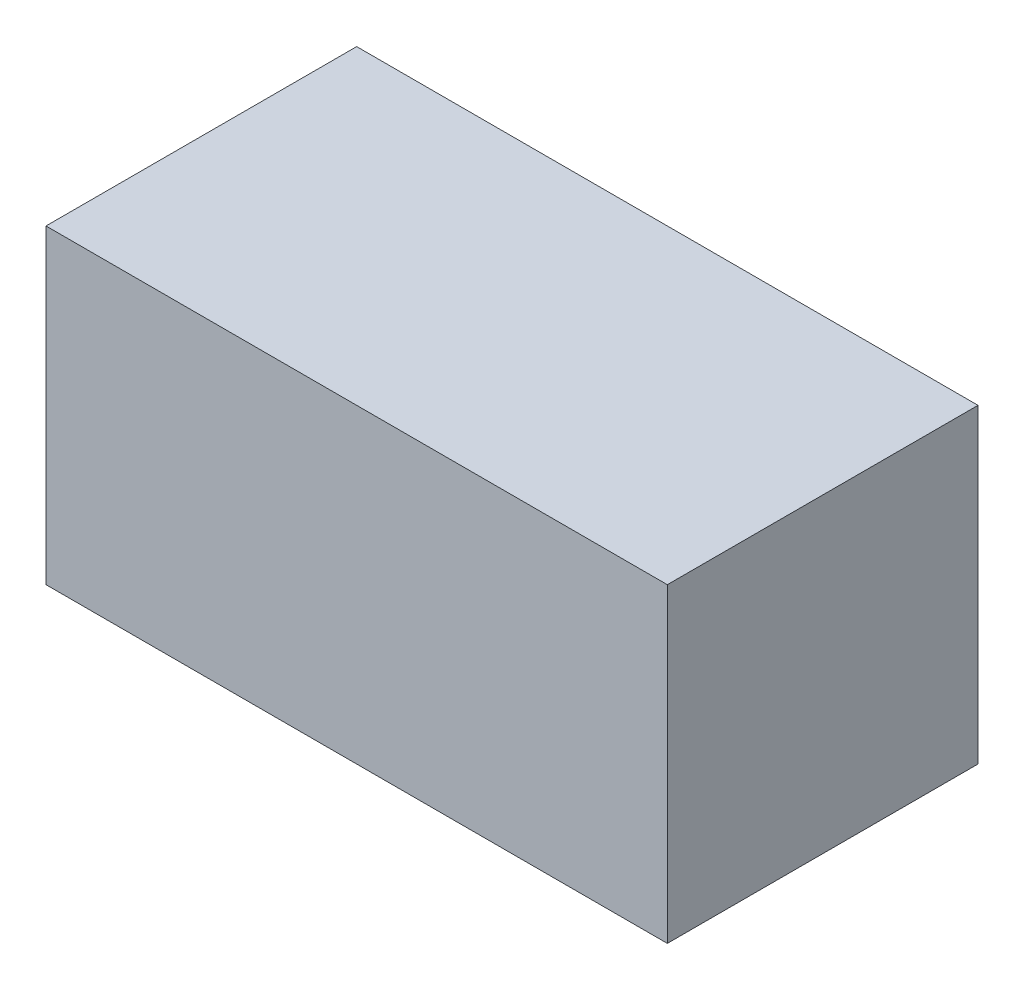
ISO-10303-21;
HEADER;
FILE_DESCRIPTION(('STEP AP214'),'2;1');
FILE_NAME('part.step','',(''),(''),'','','');
FILE_SCHEMA(('AUTOMOTIVE_DESIGN { 1 0 10303 214 1 1 1 1 }'));
ENDSEC;
DATA;
#1=APPLICATION_CONTEXT('core data for automotive mechanical design processes');
#2=APPLICATION_PROTOCOL_DEFINITION('international standard','automotive_design',2000,#1);
#3=PRODUCT_CONTEXT('',#1,'mechanical');
#4=PRODUCT('Part','Part','',(#3));
#5=PRODUCT_RELATED_PRODUCT_CATEGORY('part','',(#4));
#6=PRODUCT_DEFINITION_FORMATION('','',#4);
#7=PRODUCT_DEFINITION_CONTEXT('part definition',#1,'design');
#8=PRODUCT_DEFINITION('design','',#6,#7);
#9=PRODUCT_DEFINITION_SHAPE('','',#8);
#10=(LENGTH_UNIT() NAMED_UNIT(*) SI_UNIT(.MILLI.,.METRE.));
#11=(NAMED_UNIT(*) PLANE_ANGLE_UNIT() SI_UNIT($,.RADIAN.));
#12=(NAMED_UNIT(*) SI_UNIT($,.STERADIAN.) SOLID_ANGLE_UNIT());
#13=UNCERTAINTY_MEASURE_WITH_UNIT(LENGTH_MEASURE(1.E-05),#10,'distance_accuracy_value','');
#14=(GEOMETRIC_REPRESENTATION_CONTEXT(3) GLOBAL_UNCERTAINTY_ASSIGNED_CONTEXT((#13)) GLOBAL_UNIT_ASSIGNED_CONTEXT((#10,
#11,#12)) REPRESENTATION_CONTEXT('',''));
#15=CARTESIAN_POINT('',(0.,0.,0.));
#16=DIRECTION('',(0.,0.,1.));
#17=DIRECTION('',(1.,0.,0.));
#18=AXIS2_PLACEMENT_3D('',#15,#16,#17);
#19=CARTESIAN_POINT('',(0.,20.,10.));
#20=DIRECTION('',(1.,0.,0.));
#21=DIRECTION('',(0.,0.,-1.));
#22=AXIS2_PLACEMENT_3D('',#19,#20,#21);
#23=PLANE('',#22);
#24=DIRECTION('',(0.,-1.,0.));
#25=VECTOR('',#24,1.);
#26=CARTESIAN_POINT('',(0.,20.,-10.));
#27=LINE('',#26,#25);
#28=CARTESIAN_POINT('',(0.,20.,-10.));
#29=VERTEX_POINT('',#28);
#30=CARTESIAN_POINT('',(0.,0.,-10.));
#31=VERTEX_POINT('',#30);
#32=EDGE_CURVE('E105',#29,#31,#27,.T.);
#33=ORIENTED_EDGE('',*,*,#32,.T.);
#34=DIRECTION('',(0.,0.,-1.));
#35=VECTOR('',#34,1.);
#36=CARTESIAN_POINT('',(0.,0.,10.));
#37=LINE('',#36,#35);
#38=CARTESIAN_POINT('',(0.,0.,10.));
#39=VERTEX_POINT('',#38);
#40=EDGE_CURVE('E11',#39,#31,#37,.T.);
#41=ORIENTED_EDGE('',*,*,#40,.F.);
#42=DIRECTION('',(0.,-1.,0.));
#43=VECTOR('',#42,1.);
#44=CARTESIAN_POINT('',(0.,20.,10.));
#45=LINE('',#44,#43);
#46=CARTESIAN_POINT('',(0.,20.,10.));
#47=VERTEX_POINT('',#46);
#48=EDGE_CURVE('E93',#47,#39,#45,.T.);
#49=ORIENTED_EDGE('',*,*,#48,.F.);
#50=DIRECTION('',(0.,0.,-1.));
#51=VECTOR('',#50,1.);
#52=CARTESIAN_POINT('',(0.,20.,10.));
#53=LINE('',#52,#51);
#54=EDGE_CURVE('E101',#47,#29,#53,.T.);
#55=ORIENTED_EDGE('',*,*,#54,.T.);
#56=EDGE_LOOP('',(#33,#41,#49,#55));
#57=FACE_BOUND('',#56,.T.);
#58=ADVANCED_FACE('F42',(#57),#23,.F.);
#59=CARTESIAN_POINT('',(0.,0.,10.));
#60=DIRECTION('',(0.,1.,0.));
#61=DIRECTION('',(0.,0.,1.));
#62=AXIS2_PLACEMENT_3D('',#59,#60,#61);
#63=PLANE('',#62);
#64=DIRECTION('',(1.,0.,0.));
#65=VECTOR('',#64,1.);
#66=CARTESIAN_POINT('',(0.,0.,-10.));
#67=LINE('',#66,#65);
#68=CARTESIAN_POINT('',(40.,0.,-10.));
#69=VERTEX_POINT('',#68);
#70=EDGE_CURVE('E97',#31,#69,#67,.T.);
#71=ORIENTED_EDGE('',*,*,#70,.T.);
#72=DIRECTION('',(0.,0.,-1.));
#73=VECTOR('',#72,1.);
#74=CARTESIAN_POINT('',(40.,0.,10.));
#75=LINE('',#74,#73);
#76=CARTESIAN_POINT('',(40.,0.,10.));
#77=VERTEX_POINT('',#76);
#78=EDGE_CURVE('E50',#77,#69,#75,.T.);
#79=ORIENTED_EDGE('',*,*,#78,.F.);
#80=DIRECTION('',(1.,0.,0.));
#81=VECTOR('',#80,1.);
#82=CARTESIAN_POINT('',(0.,0.,10.));
#83=LINE('',#82,#81);
#84=EDGE_CURVE('E88',#39,#77,#83,.T.);
#85=ORIENTED_EDGE('',*,*,#84,.F.);
#86=ORIENTED_EDGE('',*,*,#40,.T.);
#87=EDGE_LOOP('',(#71,#79,#85,#86));
#88=FACE_BOUND('',#87,.T.);
#89=ADVANCED_FACE('F96',(#88),#63,.F.);
#90=CARTESIAN_POINT('',(40.,0.,10.));
#91=DIRECTION('',(-1.,0.,0.));
#92=DIRECTION('',(0.,0.,1.));
#93=AXIS2_PLACEMENT_3D('',#90,#91,#92);
#94=PLANE('',#93);
#95=DIRECTION('',(0.,1.,0.));
#96=VECTOR('',#95,1.);
#97=CARTESIAN_POINT('',(40.,0.,-10.));
#98=LINE('',#97,#96);
#99=CARTESIAN_POINT('',(40.,20.,-10.));
#100=VERTEX_POINT('',#99);
#101=EDGE_CURVE('E75',#69,#100,#98,.T.);
#102=ORIENTED_EDGE('',*,*,#101,.T.);
#103=DIRECTION('',(0.,0.,-1.));
#104=VECTOR('',#103,1.);
#105=CARTESIAN_POINT('',(40.,20.,10.));
#106=LINE('',#105,#104);
#107=CARTESIAN_POINT('',(40.,20.,10.));
#108=VERTEX_POINT('',#107);
#109=EDGE_CURVE('E98',#108,#100,#106,.T.);
#110=ORIENTED_EDGE('',*,*,#109,.F.);
#111=DIRECTION('',(0.,1.,0.));
#112=VECTOR('',#111,1.);
#113=CARTESIAN_POINT('',(40.,0.,10.));
#114=LINE('',#113,#112);
#115=EDGE_CURVE('E91',#77,#108,#114,.T.);
#116=ORIENTED_EDGE('',*,*,#115,.F.);
#117=ORIENTED_EDGE('',*,*,#78,.T.);
#118=EDGE_LOOP('',(#102,#110,#116,#117));
#119=FACE_BOUND('',#118,.T.);
#120=ADVANCED_FACE('F99',(#119),#94,.F.);
#121=CARTESIAN_POINT('',(40.,20.,10.));
#122=DIRECTION('',(0.,-1.,0.));
#123=DIRECTION('',(0.,0.,-1.));
#124=AXIS2_PLACEMENT_3D('',#121,#122,#123);
#125=PLANE('',#124);
#126=DIRECTION('',(-1.,0.,0.));
#127=VECTOR('',#126,1.);
#128=CARTESIAN_POINT('',(40.,20.,-10.));
#129=LINE('',#128,#127);
#130=EDGE_CURVE('E81',#100,#29,#129,.T.);
#131=ORIENTED_EDGE('',*,*,#130,.T.);
#132=ORIENTED_EDGE('',*,*,#54,.F.);
#133=DIRECTION('',(-1.,0.,0.));
#134=VECTOR('',#133,1.);
#135=CARTESIAN_POINT('',(40.,20.,10.));
#136=LINE('',#135,#134);
#137=EDGE_CURVE('E58',#108,#47,#136,.T.);
#138=ORIENTED_EDGE('',*,*,#137,.F.);
#139=ORIENTED_EDGE('',*,*,#109,.T.);
#140=EDGE_LOOP('',(#131,#132,#138,#139));
#141=FACE_BOUND('',#140,.T.);
#142=ADVANCED_FACE('F113',(#141),#125,.F.);
#143=CARTESIAN_POINT('',(0.,0.,10.));
#144=DIRECTION('',(0.,0.,1.));
#145=DIRECTION('',(1.,0.,0.));
#146=AXIS2_PLACEMENT_3D('',#143,#144,#145);
#147=PLANE('',#146);
#148=ORIENTED_EDGE('',*,*,#48,.T.);
#149=ORIENTED_EDGE('',*,*,#84,.T.);
#150=ORIENTED_EDGE('',*,*,#115,.T.);
#151=ORIENTED_EDGE('',*,*,#137,.T.);
#152=EDGE_LOOP('',(#148,#149,#150,#151));
#153=FACE_BOUND('',#152,.T.);
#154=ADVANCED_FACE('F89',(#153),#147,.T.);
#155=CARTESIAN_POINT('',(0.,0.,-10.));
#156=DIRECTION('',(0.,0.,1.));
#157=DIRECTION('',(1.,0.,0.));
#158=AXIS2_PLACEMENT_3D('',#155,#156,#157);
#159=PLANE('',#158);
#160=ORIENTED_EDGE('',*,*,#32,.F.);
#161=ORIENTED_EDGE('',*,*,#130,.F.);
#162=ORIENTED_EDGE('',*,*,#101,.F.);
#163=ORIENTED_EDGE('',*,*,#70,.F.);
#164=EDGE_LOOP('',(#160,#161,#162,#163));
#165=FACE_BOUND('',#164,.T.);
#166=ADVANCED_FACE('F116',(#165),#159,.F.);
#167=CLOSED_SHELL('',(#58,#89,#120,#142,#154,#166));
#168=CARTESIAN_POINT('',(20.,10.,5.));
#169=DIRECTION('',(0.,0.,-1.));
#170=DIRECTION('',(-1.,0.,0.));
#171=AXIS2_PLACEMENT_3D('',#168,#169,#170);
#172=CYLINDRICAL_SURFACE('',#171,4.);
#173=CARTESIAN_POINT('',(20.,10.,5.));
#174=DIRECTION('',(0.,0.,1.));
#175=DIRECTION('',(1.,0.,0.));
#176=AXIS2_PLACEMENT_3D('',#173,#174,#175);
#177=CIRCLE('',#176,4.);
#178=CARTESIAN_POINT('',(24.,10.,5.));
#179=VERTEX_POINT('',#178);
#180=EDGE_CURVE('E108',#179,#179,#177,.T.);
#181=ORIENTED_EDGE('',*,*,#180,.T.);
#182=EDGE_LOOP('',(#181));
#183=FACE_BOUND('',#182,.T.);
#184=CARTESIAN_POINT('',(20.,10.,0.));
#185=DIRECTION('',(0.,0.,1.));
#186=DIRECTION('',(1.,0.,0.));
#187=AXIS2_PLACEMENT_3D('',#184,#185,#186);
#188=CIRCLE('',#187,4.);
#189=CARTESIAN_POINT('',(24.,10.,0.));
#190=VERTEX_POINT('',#189);
#191=EDGE_CURVE('E119',#190,#190,#188,.T.);
#192=ORIENTED_EDGE('',*,*,#191,.F.);
#193=EDGE_LOOP('',(#192));
#194=FACE_BOUND('',#193,.T.);
#195=ADVANCED_FACE('F125',(#183,#194),#172,.F.);
#196=CARTESIAN_POINT('',(20.,10.,5.));
#197=DIRECTION('',(0.,0.,1.));
#198=DIRECTION('',(1.,0.,0.));
#199=AXIS2_PLACEMENT_3D('',#196,#197,#198);
#200=PLANE('',#199);
#201=ORIENTED_EDGE('',*,*,#180,.F.);
#202=EDGE_LOOP('',(#201));
#203=FACE_BOUND('',#202,.T.);
#204=ADVANCED_FACE('F128',(#203),#200,.F.);
#205=CARTESIAN_POINT('',(20.,10.,0.));
#206=DIRECTION('',(0.,0.,1.));
#207=DIRECTION('',(1.,0.,0.));
#208=AXIS2_PLACEMENT_3D('',#205,#206,#207);
#209=PLANE('',#208);
#210=ORIENTED_EDGE('',*,*,#191,.T.);
#211=EDGE_LOOP('',(#210));
#212=FACE_BOUND('',#211,.T.);
#213=ADVANCED_FACE('F130',(#212),#209,.T.);
#214=CLOSED_SHELL('',(#195,#204,#213));
#215=ORIENTED_CLOSED_SHELL('',*,#214,.T.);
#216=BREP_WITH_VOIDS('B2',#167,(#215));
#217=ADVANCED_BREP_SHAPE_REPRESENTATION('',(#18,#216),#14);
#218=SHAPE_DEFINITION_REPRESENTATION(#9,#217);
ENDSEC;
END-ISO-10303-21;
